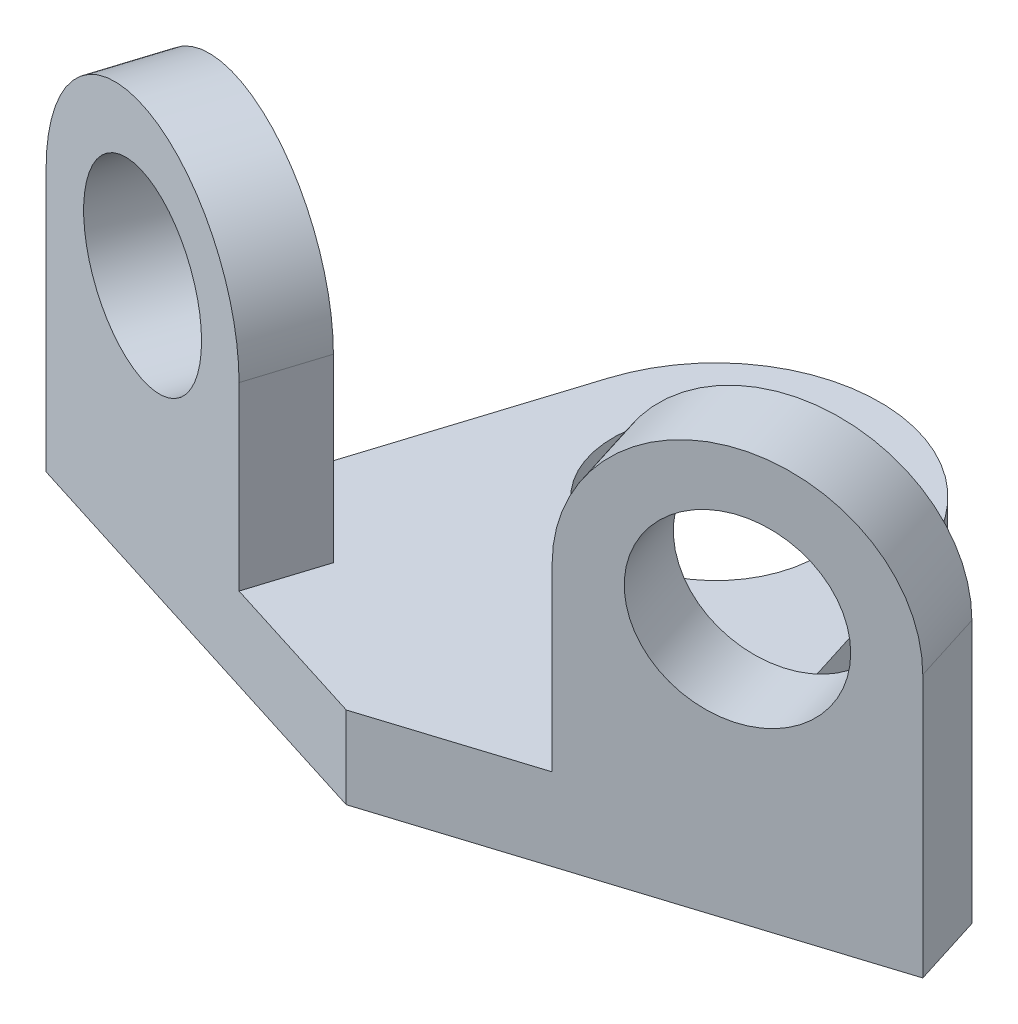
ISO-10303-21;
HEADER;
FILE_DESCRIPTION(('STEP AP214'),'2;1');
FILE_NAME('part.step','',(''),(''),'','','');
FILE_SCHEMA(('AUTOMOTIVE_DESIGN { 1 0 10303 214 1 1 1 1 }'));
ENDSEC;
DATA;
#1=APPLICATION_CONTEXT('core data for automotive mechanical design processes');
#2=APPLICATION_PROTOCOL_DEFINITION('international standard','automotive_design',2000,#1);
#3=PRODUCT_CONTEXT('',#1,'mechanical');
#4=PRODUCT('Part','Part','',(#3));
#5=PRODUCT_RELATED_PRODUCT_CATEGORY('part','',(#4));
#6=PRODUCT_DEFINITION_FORMATION('','',#4);
#7=PRODUCT_DEFINITION_CONTEXT('part definition',#1,'design');
#8=PRODUCT_DEFINITION('design','',#6,#7);
#9=PRODUCT_DEFINITION_SHAPE('','',#8);
#10=(LENGTH_UNIT() NAMED_UNIT(*) SI_UNIT(.MILLI.,.METRE.));
#11=(NAMED_UNIT(*) PLANE_ANGLE_UNIT() SI_UNIT($,.RADIAN.));
#12=(NAMED_UNIT(*) SI_UNIT($,.STERADIAN.) SOLID_ANGLE_UNIT());
#13=UNCERTAINTY_MEASURE_WITH_UNIT(LENGTH_MEASURE(1.E-05),#10,'distance_accuracy_value','');
#14=(GEOMETRIC_REPRESENTATION_CONTEXT(3) GLOBAL_UNCERTAINTY_ASSIGNED_CONTEXT((#13)) GLOBAL_UNIT_ASSIGNED_CONTEXT((#10,
#11,#12)) REPRESENTATION_CONTEXT('',''));
#15=CARTESIAN_POINT('',(0.,0.,0.));
#16=DIRECTION('',(0.,0.,1.));
#17=DIRECTION('',(1.,0.,0.));
#18=AXIS2_PLACEMENT_3D('',#15,#16,#17);
#19=CARTESIAN_POINT('',(0.,10.,0.));
#20=DIRECTION('',(-0.300705799504274,0.,0.953716950748227));
#21=DIRECTION('',(0.953716950748227,0.,0.300705799504274));
#22=AXIS2_PLACEMENT_3D('',#19,#20,#21);
#23=PLANE('',#22);
#24=CARTESIAN_POINT('',(-36.2412441284326,32.,-11.4268203811624));
#25=DIRECTION('',(-0.300705799504274,0.,0.953716950748227));
#26=DIRECTION('',(0.953716950748227,0.,0.300705799504274));
#27=AXIS2_PLACEMENT_3D('',#24,#25,#26);
#28=CIRCLE('',#27,11.);
#29=CARTESIAN_POINT('',(-25.7503576702021,32.,-8.1190565866154));
#30=VERTEX_POINT('',#29);
#31=EDGE_CURVE('E345',#30,#30,#28,.T.);
#32=ORIENTED_EDGE('',*,*,#31,.F.);
#33=EDGE_LOOP('',(#32));
#34=FACE_BOUND('',#33,.T.);
#35=CARTESIAN_POINT('',(-36.2412441284326,32.,-11.4268203811624));
#36=DIRECTION('',(-0.300705799504274,0.,0.953716950748227));
#37=DIRECTION('',(0.953716950748227,0.,0.300705799504274));
#38=AXIS2_PLACEMENT_3D('',#35,#36,#37);
#39=CIRCLE('',#38,18.);
#40=CARTESIAN_POINT('',(-19.0743390149645,32.,-6.01411599008548));
#41=VERTEX_POINT('',#40);
#42=CARTESIAN_POINT('',(-53.4081492419007,32.,-16.8395247722394));
#43=VERTEX_POINT('',#42);
#44=EDGE_CURVE('E181',#41,#43,#39,.T.);
#45=ORIENTED_EDGE('',*,*,#44,.T.);
#46=DIRECTION('',(0.,-1.,0.));
#47=VECTOR('',#46,1.);
#48=CARTESIAN_POINT('',(-53.4081492419007,50.,-16.8395247722393));
#49=LINE('',#48,#47);
#50=CARTESIAN_POINT('',(-53.4081492419007,0.,-16.8395247722393));
#51=VERTEX_POINT('',#50);
#52=EDGE_CURVE('E187',#43,#51,#49,.T.);
#53=ORIENTED_EDGE('',*,*,#52,.T.);
#54=DIRECTION('',(-0.953716950748227,0.,-0.300705799504274));
#55=VECTOR('',#54,1.);
#56=CARTESIAN_POINT('',(0.,0.,0.));
#57=LINE('',#56,#55);
#58=CARTESIAN_POINT('',(0.,0.,0.));
#59=VERTEX_POINT('',#58);
#60=EDGE_CURVE('E253',#59,#51,#57,.T.);
#61=ORIENTED_EDGE('',*,*,#60,.F.);
#62=DIRECTION('',(0.,-1.,0.));
#63=VECTOR('',#62,1.);
#64=CARTESIAN_POINT('',(0.,10.,0.));
#65=LINE('',#64,#63);
#66=CARTESIAN_POINT('',(0.,10.,0.));
#67=VERTEX_POINT('',#66);
#68=EDGE_CURVE('E258',#67,#59,#65,.T.);
#69=ORIENTED_EDGE('',*,*,#68,.F.);
#70=DIRECTION('',(-0.953716950748227,0.,-0.300705799504274));
#71=VECTOR('',#70,1.);
#72=CARTESIAN_POINT('',(0.,10.,0.));
#73=LINE('',#72,#71);
#74=CARTESIAN_POINT('',(-19.0743390149645,10.,-6.01411599008548));
#75=VERTEX_POINT('',#74);
#76=EDGE_CURVE('E227',#67,#75,#73,.T.);
#77=ORIENTED_EDGE('',*,*,#76,.T.);
#78=DIRECTION('',(0.,-1.,0.));
#79=VECTOR('',#78,1.);
#80=CARTESIAN_POINT('',(-19.0743390149645,50.,-6.01411599008548));
#81=LINE('',#80,#79);
#82=EDGE_CURVE('E186',#41,#75,#81,.T.);
#83=ORIENTED_EDGE('',*,*,#82,.F.);
#84=EDGE_LOOP('',(#45,#53,#61,#69,#77,#83));
#85=FACE_BOUND('',#84,.T.);
#86=ADVANCED_FACE('F87',(#34,#85),#23,.T.);
#87=CARTESIAN_POINT('',(2.75534884166856,50.,-8.73885006493346));
#88=DIRECTION('',(0.300705799504274,0.,-0.953716950748226));
#89=DIRECTION('',(-0.953716950748227,0.,-0.300705799504274));
#90=AXIS2_PLACEMENT_3D('',#87,#88,#89);
#91=PLANE('',#90);
#92=CARTESIAN_POINT('',(-33.4858952867641,32.,-20.1656704460959));
#93=DIRECTION('',(0.300705799504274,0.,-0.953716950748226));
#94=DIRECTION('',(-0.953716950748227,0.,-0.300705799504274));
#95=AXIS2_PLACEMENT_3D('',#92,#93,#94);
#96=CIRCLE('',#95,11.);
#97=CARTESIAN_POINT('',(-43.9767817449946,32.,-23.4734342406429));
#98=VERTEX_POINT('',#97);
#99=EDGE_CURVE('E93',#98,#98,#96,.T.);
#100=ORIENTED_EDGE('',*,*,#99,.F.);
#101=EDGE_LOOP('',(#100));
#102=FACE_BOUND('',#101,.T.);
#103=DIRECTION('',(0.,-1.,0.));
#104=VECTOR('',#103,1.);
#105=CARTESIAN_POINT('',(-50.6528004002321,50.,-25.5783748371728));
#106=LINE('',#105,#104);
#107=CARTESIAN_POINT('',(-50.6528004002321,32.,-25.5783748371728));
#108=VERTEX_POINT('',#107);
#109=CARTESIAN_POINT('',(-50.6528004002321,0.,-25.5783748371728));
#110=VERTEX_POINT('',#109);
#111=EDGE_CURVE('E199',#108,#110,#106,.T.);
#112=ORIENTED_EDGE('',*,*,#111,.F.);
#113=CARTESIAN_POINT('',(-33.4858952867641,32.,-20.1656704460959));
#114=DIRECTION('',(0.300705799504274,0.,-0.953716950748226));
#115=DIRECTION('',(-0.953716950748227,0.,-0.300705799504274));
#116=AXIS2_PLACEMENT_3D('',#113,#114,#115);
#117=CIRCLE('',#116,18.);
#118=CARTESIAN_POINT('',(-16.318990173296,32.,-14.7529660550189));
#119=VERTEX_POINT('',#118);
#120=EDGE_CURVE('E194',#108,#119,#117,.T.);
#121=ORIENTED_EDGE('',*,*,#120,.T.);
#122=DIRECTION('',(0.,-1.,0.));
#123=VECTOR('',#122,1.);
#124=CARTESIAN_POINT('',(-16.318990173296,50.,-14.7529660550189));
#125=LINE('',#124,#123);
#126=CARTESIAN_POINT('',(-16.318990173296,10.,-14.7529660550189));
#127=VERTEX_POINT('',#126);
#128=EDGE_CURVE('E204',#119,#127,#125,.T.);
#129=ORIENTED_EDGE('',*,*,#128,.T.);
#130=DIRECTION('',(0.953716950748227,0.,0.300705799504274));
#131=VECTOR('',#130,1.);
#132=CARTESIAN_POINT('',(2.75534884166856,10.,-8.73885006493346));
#133=LINE('',#132,#131);
#134=CARTESIAN_POINT('',(-29.1978952889004,10.,-18.8136692400564));
#135=VERTEX_POINT('',#134);
#136=EDGE_CURVE('E219',#135,#127,#133,.T.);
#137=ORIENTED_EDGE('',*,*,#136,.F.);
#138=DIRECTION('',(0.,-1.,0.));
#139=VECTOR('',#138,1.);
#140=CARTESIAN_POINT('',(-29.1978952889004,10.,-18.8136692400564));
#141=LINE('',#140,#139);
#142=CARTESIAN_POINT('',(-29.1978952889004,0.,-18.8136692400564));
#143=VERTEX_POINT('',#142);
#144=EDGE_CURVE('E256',#135,#143,#141,.T.);
#145=ORIENTED_EDGE('',*,*,#144,.T.);
#146=DIRECTION('',(0.953716950748227,0.,0.300705799504274));
#147=VECTOR('',#146,1.);
#148=CARTESIAN_POINT('',(2.75534884166856,0.,-8.73885006493346));
#149=LINE('',#148,#147);
#150=EDGE_CURVE('E266',#110,#143,#149,.T.);
#151=ORIENTED_EDGE('',*,*,#150,.F.);
#152=EDGE_LOOP('',(#112,#121,#129,#137,#145,#151));
#153=FACE_BOUND('',#152,.T.);
#154=ADVANCED_FACE('F293',(#102,#153),#91,.T.);
#155=CARTESIAN_POINT('',(-19.0743390149645,50.,-6.01411599008549));
#156=DIRECTION('',(0.953716950748227,0.,0.300705799504274));
#157=DIRECTION('',(0.300705799504274,0.,-0.953716950748227));
#158=AXIS2_PLACEMENT_3D('',#155,#156,#157);
#159=PLANE('',#158);
#160=ORIENTED_EDGE('',*,*,#128,.F.);
#161=DIRECTION('',(-0.300705799504274,0.,0.953716950748227));
#162=VECTOR('',#161,1.);
#163=CARTESIAN_POINT('',(-13.060223024879,32.,-25.08845500505));
#164=LINE('',#163,#162);
#165=EDGE_CURVE('E102',#119,#41,#164,.T.);
#166=ORIENTED_EDGE('',*,*,#165,.T.);
#167=ORIENTED_EDGE('',*,*,#82,.T.);
#168=DIRECTION('',(-0.300705799504274,0.,0.953716950748226));
#169=VECTOR('',#168,1.);
#170=CARTESIAN_POINT('',(-19.0743390149645,10.,-6.01411599008549));
#171=LINE('',#170,#169);
#172=EDGE_CURVE('E224',#127,#75,#171,.T.);
#173=ORIENTED_EDGE('',*,*,#172,.F.);
#174=EDGE_LOOP('',(#160,#166,#167,#173));
#175=FACE_BOUND('',#174,.T.);
#176=ADVANCED_FACE('F299',(#175),#159,.T.);
#177=CARTESIAN_POINT('',(-2.75534884166856,50.,-8.73885006493346));
#178=DIRECTION('',(0.300705799504274,0.,0.953716950748226));
#179=DIRECTION('',(0.953716950748227,0.,-0.300705799504274));
#180=AXIS2_PLACEMENT_3D('',#177,#178,#179);
#181=PLANE('',#180);
#182=CARTESIAN_POINT('',(33.4858952867641,32.,-20.1656704460959));
#183=DIRECTION('',(0.300705799504274,0.,0.953716950748226));
#184=DIRECTION('',(0.953716950748227,0.,-0.300705799504274));
#185=AXIS2_PLACEMENT_3D('',#182,#183,#184);
#186=CIRCLE('',#185,11.);
#187=CARTESIAN_POINT('',(43.9767817449946,32.,-23.4734342406429));
#188=VERTEX_POINT('',#187);
#189=EDGE_CURVE('E262',#188,#188,#186,.T.);
#190=ORIENTED_EDGE('',*,*,#189,.T.);
#191=EDGE_LOOP('',(#190));
#192=FACE_BOUND('',#191,.T.);
#193=DIRECTION('',(0.,-1.,0.));
#194=VECTOR('',#193,1.);
#195=CARTESIAN_POINT('',(16.318990173296,50.,-14.7529660550189));
#196=LINE('',#195,#194);
#197=CARTESIAN_POINT('',(16.318990173296,32.,-14.7529660550189));
#198=VERTEX_POINT('',#197);
#199=CARTESIAN_POINT('',(16.318990173296,10.,-14.7529660550189));
#200=VERTEX_POINT('',#199);
#201=EDGE_CURVE('E244',#198,#200,#196,.T.);
#202=ORIENTED_EDGE('',*,*,#201,.F.);
#203=CARTESIAN_POINT('',(33.4858952867641,32.,-20.1656704460959));
#204=DIRECTION('',(0.300705799504274,0.,0.953716950748226));
#205=DIRECTION('',(0.953716950748227,0.,-0.300705799504274));
#206=AXIS2_PLACEMENT_3D('',#203,#204,#205);
#207=CIRCLE('',#206,18.);
#208=CARTESIAN_POINT('',(50.6528004002321,32.,-25.5783748371728));
#209=VERTEX_POINT('',#208);
#210=EDGE_CURVE('E270',#209,#198,#207,.T.);
#211=ORIENTED_EDGE('',*,*,#210,.F.);
#212=DIRECTION('',(0.,-1.,0.));
#213=VECTOR('',#212,1.);
#214=CARTESIAN_POINT('',(50.6528004002321,50.,-25.5783748371728));
#215=LINE('',#214,#213);
#216=CARTESIAN_POINT('',(50.6528004002321,0.,-25.5783748371728));
#217=VERTEX_POINT('',#216);
#218=EDGE_CURVE('E283',#209,#217,#215,.T.);
#219=ORIENTED_EDGE('',*,*,#218,.T.);
#220=DIRECTION('',(-0.953716950748227,0.,0.300705799504274));
#221=VECTOR('',#220,1.);
#222=CARTESIAN_POINT('',(-2.75534884166856,0.,-8.73885006493346));
#223=LINE('',#222,#221);
#224=CARTESIAN_POINT('',(29.1978952889004,0.,-18.8136692400564));
#225=VERTEX_POINT('',#224);
#226=EDGE_CURVE('E205',#217,#225,#223,.T.);
#227=ORIENTED_EDGE('',*,*,#226,.T.);
#228=DIRECTION('',(0.,-1.,0.));
#229=VECTOR('',#228,1.);
#230=CARTESIAN_POINT('',(29.1978952889004,10.,-18.8136692400564));
#231=LINE('',#230,#229);
#232=CARTESIAN_POINT('',(29.1978952889004,10.,-18.8136692400564));
#233=VERTEX_POINT('',#232);
#234=EDGE_CURVE('E240',#233,#225,#231,.T.);
#235=ORIENTED_EDGE('',*,*,#234,.F.);
#236=DIRECTION('',(-0.953716950748227,0.,0.300705799504274));
#237=VECTOR('',#236,1.);
#238=CARTESIAN_POINT('',(-2.75534884166856,10.,-8.73885006493346));
#239=LINE('',#238,#237);
#240=EDGE_CURVE('E231',#233,#200,#239,.T.);
#241=ORIENTED_EDGE('',*,*,#240,.T.);
#242=EDGE_LOOP('',(#202,#211,#219,#227,#235,#241));
#243=FACE_BOUND('',#242,.T.);
#244=ADVANCED_FACE('F322',(#192,#243),#181,.F.);
#245=CARTESIAN_POINT('',(19.0743390149645,50.,-6.01411599008549));
#246=DIRECTION('',(0.953716950748227,0.,-0.300705799504274));
#247=DIRECTION('',(-0.300705799504274,0.,-0.953716950748227));
#248=AXIS2_PLACEMENT_3D('',#245,#246,#247);
#249=PLANE('',#248);
#250=DIRECTION('',(0.300705799504274,0.,0.953716950748227));
#251=VECTOR('',#250,1.);
#252=CARTESIAN_POINT('',(13.0602230248791,32.,-25.08845500505));
#253=LINE('',#252,#251);
#254=CARTESIAN_POINT('',(19.0743390149645,32.,-6.01411599008548));
#255=VERTEX_POINT('',#254);
#256=EDGE_CURVE('E96',#198,#255,#253,.T.);
#257=ORIENTED_EDGE('',*,*,#256,.F.);
#258=ORIENTED_EDGE('',*,*,#201,.T.);
#259=DIRECTION('',(0.300705799504274,0.,0.953716950748226));
#260=VECTOR('',#259,1.);
#261=CARTESIAN_POINT('',(19.0743390149645,10.,-6.01411599008549));
#262=LINE('',#261,#260);
#263=CARTESIAN_POINT('',(19.0743390149645,10.,-6.01411599008548));
#264=VERTEX_POINT('',#263);
#265=EDGE_CURVE('E232',#200,#264,#262,.T.);
#266=ORIENTED_EDGE('',*,*,#265,.T.);
#267=DIRECTION('',(0.,-1.,0.));
#268=VECTOR('',#267,1.);
#269=CARTESIAN_POINT('',(19.0743390149645,50.,-6.01411599008548));
#270=LINE('',#269,#268);
#271=EDGE_CURVE('E286',#255,#264,#270,.T.);
#272=ORIENTED_EDGE('',*,*,#271,.F.);
#273=EDGE_LOOP('',(#257,#258,#266,#272));
#274=FACE_BOUND('',#273,.T.);
#275=ADVANCED_FACE('F321',(#274),#249,.F.);
#276=CARTESIAN_POINT('',(31.9532441305689,10.,-10.0748191751229));
#277=DIRECTION('',(0.953716950748227,0.,-0.300705799504274));
#278=DIRECTION('',(-0.300705799504274,0.,-0.953716950748227));
#279=AXIS2_PLACEMENT_3D('',#276,#277,#278);
#280=PLANE('',#279);
#281=DIRECTION('',(0.300705799504274,0.,0.953716950748227));
#282=VECTOR('',#281,1.);
#283=CARTESIAN_POINT('',(31.9532441305689,0.,-10.0748191751229));
#284=LINE('',#283,#282);
#285=CARTESIAN_POINT('',(19.4989612923106,0.,-49.5747578921042));
#286=VERTEX_POINT('',#285);
#287=EDGE_CURVE('E242',#286,#225,#284,.T.);
#288=ORIENTED_EDGE('',*,*,#287,.F.);
#289=DIRECTION('',(0.,-1.,0.));
#290=VECTOR('',#289,1.);
#291=CARTESIAN_POINT('',(19.4989612923106,10.,-49.5747578921042));
#292=LINE('',#291,#290);
#293=CARTESIAN_POINT('',(19.4989612923106,10.,-49.5747578921042));
#294=VERTEX_POINT('',#293);
#295=EDGE_CURVE('E263',#294,#286,#292,.T.);
#296=ORIENTED_EDGE('',*,*,#295,.F.);
#297=DIRECTION('',(0.300705799504274,0.,0.953716950748227));
#298=VECTOR('',#297,1.);
#299=CARTESIAN_POINT('',(31.9532441305689,10.,-10.0748191751229));
#300=LINE('',#299,#298);
#301=EDGE_CURVE('E211',#294,#233,#300,.T.);
#302=ORIENTED_EDGE('',*,*,#301,.T.);
#303=ORIENTED_EDGE('',*,*,#234,.T.);
#304=EDGE_LOOP('',(#288,#296,#302,#303));
#305=FACE_BOUND('',#304,.T.);
#306=ADVANCED_FACE('F328',(#305),#280,.T.);
#307=CARTESIAN_POINT('',(0.0292026001076146,10.,-44.999990524534));
#308=DIRECTION('',(0.,-1.,0.));
#309=DIRECTION('',(0.,0.,-1.));
#310=AXIS2_PLACEMENT_3D('',#307,#308,#309);
#311=CYLINDRICAL_SURFACE('',#310,20.);
#312=CARTESIAN_POINT('',(0.0292026001076146,0.,-44.999990524534));
#313=DIRECTION('',(0.,1.,0.));
#314=DIRECTION('',(0.,0.,1.));
#315=AXIS2_PLACEMENT_3D('',#312,#313,#314);
#316=CIRCLE('',#315,20.);
#317=CARTESIAN_POINT('',(-19.0451364148569,0.,-51.0141065146194));
#318=VERTEX_POINT('',#317);
#319=EDGE_CURVE('E243',#286,#318,#316,.T.);
#320=ORIENTED_EDGE('',*,*,#319,.T.);
#321=DIRECTION('',(0.,-1.,0.));
#322=VECTOR('',#321,1.);
#323=CARTESIAN_POINT('',(-19.0451364148569,10.,-51.0141065146194));
#324=LINE('',#323,#322);
#325=CARTESIAN_POINT('',(-19.0451364148569,10.,-51.0141065146194));
#326=VERTEX_POINT('',#325);
#327=EDGE_CURVE('E257',#326,#318,#324,.T.);
#328=ORIENTED_EDGE('',*,*,#327,.F.);
#329=CARTESIAN_POINT('',(0.0292026001076146,10.,-44.999990524534));
#330=DIRECTION('',(0.,1.,0.));
#331=DIRECTION('',(0.,0.,1.));
#332=AXIS2_PLACEMENT_3D('',#329,#330,#331);
#333=CIRCLE('',#332,20.);
#334=EDGE_CURVE('E212',#294,#326,#333,.T.);
#335=ORIENTED_EDGE('',*,*,#334,.F.);
#336=ORIENTED_EDGE('',*,*,#295,.T.);
#337=EDGE_LOOP('',(#320,#328,#335,#336));
#338=FACE_BOUND('',#337,.T.);
#339=ADVANCED_FACE('F332',(#338),#311,.T.);
#340=CARTESIAN_POINT('',(-31.9532441305689,10.,-10.0748191751229));
#341=DIRECTION('',(0.953716950748227,0.,0.300705799504274));
#342=DIRECTION('',(0.300705799504274,0.,-0.953716950748227));
#343=AXIS2_PLACEMENT_3D('',#340,#341,#342);
#344=PLANE('',#343);
#345=DIRECTION('',(-0.300705799504274,0.,0.953716950748227));
#346=VECTOR('',#345,1.);
#347=CARTESIAN_POINT('',(-31.9532441305689,0.,-10.0748191751229));
#348=LINE('',#347,#346);
#349=EDGE_CURVE('E249',#318,#143,#348,.T.);
#350=ORIENTED_EDGE('',*,*,#349,.T.);
#351=ORIENTED_EDGE('',*,*,#144,.F.);
#352=DIRECTION('',(-0.300705799504274,0.,0.953716950748227));
#353=VECTOR('',#352,1.);
#354=CARTESIAN_POINT('',(-31.9532441305689,10.,-10.0748191751229));
#355=LINE('',#354,#353);
#356=EDGE_CURVE('E220',#326,#135,#355,.T.);
#357=ORIENTED_EDGE('',*,*,#356,.F.);
#358=ORIENTED_EDGE('',*,*,#327,.T.);
#359=EDGE_LOOP('',(#350,#351,#357,#358));
#360=FACE_BOUND('',#359,.T.);
#361=ADVANCED_FACE('F308',(#360),#344,.F.);
#362=CARTESIAN_POINT('',(0.,10.,0.));
#363=DIRECTION('',(-0.300705799504274,0.,-0.953716950748227));
#364=DIRECTION('',(-0.953716950748227,0.,0.300705799504274));
#365=AXIS2_PLACEMENT_3D('',#362,#363,#364);
#366=PLANE('',#365);
#367=CARTESIAN_POINT('',(36.2412441284326,32.,-11.4268203811624));
#368=DIRECTION('',(0.300705799504274,0.,0.953716950748227));
#369=DIRECTION('',(0.953716950748227,0.,-0.300705799504274));
#370=AXIS2_PLACEMENT_3D('',#367,#368,#369);
#371=CIRCLE('',#370,11.);
#372=CARTESIAN_POINT('',(46.7321305866631,32.,-14.7345841757094));
#373=VERTEX_POINT('',#372);
#374=EDGE_CURVE('E275',#373,#373,#371,.T.);
#375=ORIENTED_EDGE('',*,*,#374,.F.);
#376=EDGE_LOOP('',(#375));
#377=FACE_BOUND('',#376,.T.);
#378=CARTESIAN_POINT('',(36.2412441284326,32.,-11.4268203811624));
#379=DIRECTION('',(0.300705799504274,0.,0.953716950748227));
#380=DIRECTION('',(0.953716950748227,0.,-0.300705799504274));
#381=AXIS2_PLACEMENT_3D('',#378,#379,#380);
#382=CIRCLE('',#381,18.);
#383=CARTESIAN_POINT('',(53.4081492419007,32.,-16.8395247722394));
#384=VERTEX_POINT('',#383);
#385=EDGE_CURVE('E337',#384,#255,#382,.T.);
#386=ORIENTED_EDGE('',*,*,#385,.T.);
#387=ORIENTED_EDGE('',*,*,#271,.T.);
#388=DIRECTION('',(0.953716950748227,0.,-0.300705799504274));
#389=VECTOR('',#388,1.);
#390=CARTESIAN_POINT('',(0.,10.,0.));
#391=LINE('',#390,#389);
#392=EDGE_CURVE('E230',#67,#264,#391,.T.);
#393=ORIENTED_EDGE('',*,*,#392,.F.);
#394=ORIENTED_EDGE('',*,*,#68,.T.);
#395=DIRECTION('',(0.953716950748227,0.,-0.300705799504274));
#396=VECTOR('',#395,1.);
#397=CARTESIAN_POINT('',(0.,0.,0.));
#398=LINE('',#397,#396);
#399=CARTESIAN_POINT('',(53.4081492419007,0.,-16.8395247722393));
#400=VERTEX_POINT('',#399);
#401=EDGE_CURVE('E215',#59,#400,#398,.T.);
#402=ORIENTED_EDGE('',*,*,#401,.T.);
#403=DIRECTION('',(0.,-1.,0.));
#404=VECTOR('',#403,1.);
#405=CARTESIAN_POINT('',(53.4081492419007,50.,-16.8395247722393));
#406=LINE('',#405,#404);
#407=EDGE_CURVE('E290',#384,#400,#406,.T.);
#408=ORIENTED_EDGE('',*,*,#407,.F.);
#409=EDGE_LOOP('',(#386,#387,#393,#394,#402,#408));
#410=FACE_BOUND('',#409,.T.);
#411=ADVANCED_FACE('F316',(#377,#410),#366,.F.);
#412=CARTESIAN_POINT('',(0.0292026001076146,10.,-44.999990524534));
#413=DIRECTION('',(0.,-1.,0.));
#414=DIRECTION('',(0.,0.,-1.));
#415=AXIS2_PLACEMENT_3D('',#412,#413,#414);
#416=CYLINDRICAL_SURFACE('',#415,12.5);
#417=CARTESIAN_POINT('',(0.0292026001076146,10.,-44.999990524534));
#418=DIRECTION('',(0.,1.,0.));
#419=DIRECTION('',(0.,0.,1.));
#420=AXIS2_PLACEMENT_3D('',#417,#418,#419);
#421=CIRCLE('',#420,12.5);
#422=CARTESIAN_POINT('',(0.0292026001076146,10.,-32.499990524534));
#423=VERTEX_POINT('',#422);
#424=EDGE_CURVE('E208',#423,#423,#421,.T.);
#425=ORIENTED_EDGE('',*,*,#424,.T.);
#426=EDGE_LOOP('',(#425));
#427=FACE_BOUND('',#426,.T.);
#428=CARTESIAN_POINT('',(0.0292026001076146,0.,-44.999990524534));
#429=DIRECTION('',(0.,1.,0.));
#430=DIRECTION('',(0.,0.,1.));
#431=AXIS2_PLACEMENT_3D('',#428,#429,#430);
#432=CIRCLE('',#431,12.5);
#433=CARTESIAN_POINT('',(0.0292026001076146,0.,-32.499990524534));
#434=VERTEX_POINT('',#433);
#435=EDGE_CURVE('E236',#434,#434,#432,.T.);
#436=ORIENTED_EDGE('',*,*,#435,.F.);
#437=EDGE_LOOP('',(#436));
#438=FACE_BOUND('',#437,.T.);
#439=ADVANCED_FACE('F90',(#427,#438),#416,.F.);
#440=CARTESIAN_POINT('',(0.,10.,0.));
#441=DIRECTION('',(0.,1.,0.));
#442=DIRECTION('',(0.,0.,1.));
#443=AXIS2_PLACEMENT_3D('',#440,#441,#442);
#444=PLANE('',#443);
#445=ORIENTED_EDGE('',*,*,#424,.F.);
#446=EDGE_LOOP('',(#445));
#447=FACE_BOUND('',#446,.T.);
#448=ORIENTED_EDGE('',*,*,#301,.F.);
#449=ORIENTED_EDGE('',*,*,#334,.T.);
#450=ORIENTED_EDGE('',*,*,#356,.T.);
#451=ORIENTED_EDGE('',*,*,#136,.T.);
#452=ORIENTED_EDGE('',*,*,#172,.T.);
#453=ORIENTED_EDGE('',*,*,#76,.F.);
#454=ORIENTED_EDGE('',*,*,#392,.T.);
#455=ORIENTED_EDGE('',*,*,#265,.F.);
#456=ORIENTED_EDGE('',*,*,#240,.F.);
#457=EDGE_LOOP('',(#448,#449,#450,#451,#452,#453,#454,#455,#456));
#458=FACE_BOUND('',#457,.T.);
#459=ADVANCED_FACE('F302',(#447,#458),#444,.T.);
#460=CARTESIAN_POINT('',(0.,0.,0.));
#461=DIRECTION('',(0.,1.,0.));
#462=DIRECTION('',(0.,0.,1.));
#463=AXIS2_PLACEMENT_3D('',#460,#461,#462);
#464=PLANE('',#463);
#465=DIRECTION('',(-0.300705799504275,0.,-0.953716950748226));
#466=VECTOR('',#465,1.);
#467=CARTESIAN_POINT('',(53.4081492419007,0.,-16.8395247722394));
#468=LINE('',#467,#466);
#469=EDGE_CURVE('E284',#400,#217,#468,.T.);
#470=ORIENTED_EDGE('',*,*,#469,.F.);
#471=ORIENTED_EDGE('',*,*,#401,.F.);
#472=ORIENTED_EDGE('',*,*,#60,.T.);
#473=DIRECTION('',(0.300705799504275,0.,-0.953716950748226));
#474=VECTOR('',#473,1.);
#475=CARTESIAN_POINT('',(-53.4081492419007,0.,-16.8395247722394));
#476=LINE('',#475,#474);
#477=EDGE_CURVE('E200',#51,#110,#476,.T.);
#478=ORIENTED_EDGE('',*,*,#477,.T.);
#479=ORIENTED_EDGE('',*,*,#150,.T.);
#480=ORIENTED_EDGE('',*,*,#349,.F.);
#481=ORIENTED_EDGE('',*,*,#319,.F.);
#482=ORIENTED_EDGE('',*,*,#287,.T.);
#483=ORIENTED_EDGE('',*,*,#226,.F.);
#484=EDGE_LOOP('',(#470,#471,#472,#478,#479,#480,#481,#482,#483));
#485=FACE_BOUND('',#484,.T.);
#486=ORIENTED_EDGE('',*,*,#435,.T.);
#487=EDGE_LOOP('',(#486));
#488=FACE_BOUND('',#487,.T.);
#489=ADVANCED_FACE('F309',(#485,#488),#464,.F.);
#490=CARTESIAN_POINT('',(-53.4081492419007,50.,-16.8395247722394));
#491=DIRECTION('',(-0.953716950748227,0.,-0.300705799504275));
#492=DIRECTION('',(-0.300705799504275,0.,0.953716950748227));
#493=AXIS2_PLACEMENT_3D('',#490,#491,#492);
#494=PLANE('',#493);
#495=DIRECTION('',(-0.300705799504274,0.,0.953716950748227));
#496=VECTOR('',#495,1.);
#497=CARTESIAN_POINT('',(-47.3940332518152,32.,-35.9138637872039));
#498=LINE('',#497,#496);
#499=EDGE_CURVE('E12',#108,#43,#498,.T.);
#500=ORIENTED_EDGE('',*,*,#499,.F.);
#501=ORIENTED_EDGE('',*,*,#111,.T.);
#502=ORIENTED_EDGE('',*,*,#477,.F.);
#503=ORIENTED_EDGE('',*,*,#52,.F.);
#504=EDGE_LOOP('',(#500,#501,#502,#503));
#505=FACE_BOUND('',#504,.T.);
#506=ADVANCED_FACE('F197',(#505),#494,.T.);
#507=CARTESIAN_POINT('',(53.4081492419007,50.,-16.8395247722394));
#508=DIRECTION('',(-0.953716950748227,0.,0.300705799504275));
#509=DIRECTION('',(0.300705799504275,0.,0.953716950748227));
#510=AXIS2_PLACEMENT_3D('',#507,#508,#509);
#511=PLANE('',#510);
#512=ORIENTED_EDGE('',*,*,#218,.F.);
#513=DIRECTION('',(0.300705799504274,0.,0.953716950748227));
#514=VECTOR('',#513,1.);
#515=CARTESIAN_POINT('',(47.3940332518152,32.,-35.9138637872039));
#516=LINE('',#515,#514);
#517=EDGE_CURVE('E115',#209,#384,#516,.T.);
#518=ORIENTED_EDGE('',*,*,#517,.T.);
#519=ORIENTED_EDGE('',*,*,#407,.T.);
#520=ORIENTED_EDGE('',*,*,#469,.T.);
#521=EDGE_LOOP('',(#512,#518,#519,#520));
#522=FACE_BOUND('',#521,.T.);
#523=ADVANCED_FACE('F331',(#522),#511,.F.);
#524=CARTESIAN_POINT('',(30.2271281383471,32.,-30.501159396127));
#525=DIRECTION('',(0.300705799504274,0.,0.953716950748227));
#526=DIRECTION('',(0.953716950748227,0.,-0.300705799504274));
#527=AXIS2_PLACEMENT_3D('',#524,#525,#526);
#528=CYLINDRICAL_SURFACE('',#527,11.);
#529=ORIENTED_EDGE('',*,*,#374,.T.);
#530=EDGE_LOOP('',(#529));
#531=FACE_BOUND('',#530,.T.);
#532=ORIENTED_EDGE('',*,*,#189,.F.);
#533=EDGE_LOOP('',(#532));
#534=FACE_BOUND('',#533,.T.);
#535=ADVANCED_FACE('F404',(#531,#534),#528,.F.);
#536=CARTESIAN_POINT('',(30.2271281383471,32.,-30.501159396127));
#537=DIRECTION('',(0.300705799504274,0.,0.953716950748227));
#538=DIRECTION('',(0.953716950748227,0.,-0.300705799504274));
#539=AXIS2_PLACEMENT_3D('',#536,#537,#538);
#540=CYLINDRICAL_SURFACE('',#539,18.);
#541=ORIENTED_EDGE('',*,*,#210,.T.);
#542=ORIENTED_EDGE('',*,*,#256,.T.);
#543=ORIENTED_EDGE('',*,*,#385,.F.);
#544=ORIENTED_EDGE('',*,*,#517,.F.);
#545=EDGE_LOOP('',(#541,#542,#543,#544));
#546=FACE_BOUND('',#545,.T.);
#547=ADVANCED_FACE('F340',(#546),#540,.T.);
#548=CARTESIAN_POINT('',(-30.2271281383471,32.,-30.501159396127));
#549=DIRECTION('',(-0.300705799504274,0.,0.953716950748227));
#550=DIRECTION('',(0.953716950748227,0.,0.300705799504274));
#551=AXIS2_PLACEMENT_3D('',#548,#549,#550);
#552=CYLINDRICAL_SURFACE('',#551,11.);
#553=ORIENTED_EDGE('',*,*,#99,.T.);
#554=EDGE_LOOP('',(#553));
#555=FACE_BOUND('',#554,.T.);
#556=ORIENTED_EDGE('',*,*,#31,.T.);
#557=EDGE_LOOP('',(#556));
#558=FACE_BOUND('',#557,.T.);
#559=ADVANCED_FACE('F350',(#555,#558),#552,.F.);
#560=CARTESIAN_POINT('',(-30.2271281383471,32.,-30.501159396127));
#561=DIRECTION('',(-0.300705799504274,0.,0.953716950748227));
#562=DIRECTION('',(0.953716950748227,0.,0.300705799504274));
#563=AXIS2_PLACEMENT_3D('',#560,#561,#562);
#564=CYLINDRICAL_SURFACE('',#563,18.);
#565=ORIENTED_EDGE('',*,*,#120,.F.);
#566=ORIENTED_EDGE('',*,*,#499,.T.);
#567=ORIENTED_EDGE('',*,*,#44,.F.);
#568=ORIENTED_EDGE('',*,*,#165,.F.);
#569=EDGE_LOOP('',(#565,#566,#567,#568));
#570=FACE_BOUND('',#569,.T.);
#571=ADVANCED_FACE('F195',(#570),#564,.T.);
#572=CLOSED_SHELL('',(#86,#154,#176,#244,#275,#306,#339,#361,#411,#439,#459,#489,#506,#523,#535,
#547,#559,#571));
#573=MANIFOLD_SOLID_BREP('B2',#572);
#574=ADVANCED_BREP_SHAPE_REPRESENTATION('',(#18,#573),#14);
#575=SHAPE_DEFINITION_REPRESENTATION(#9,#574);
ENDSEC;
END-ISO-10303-21;
